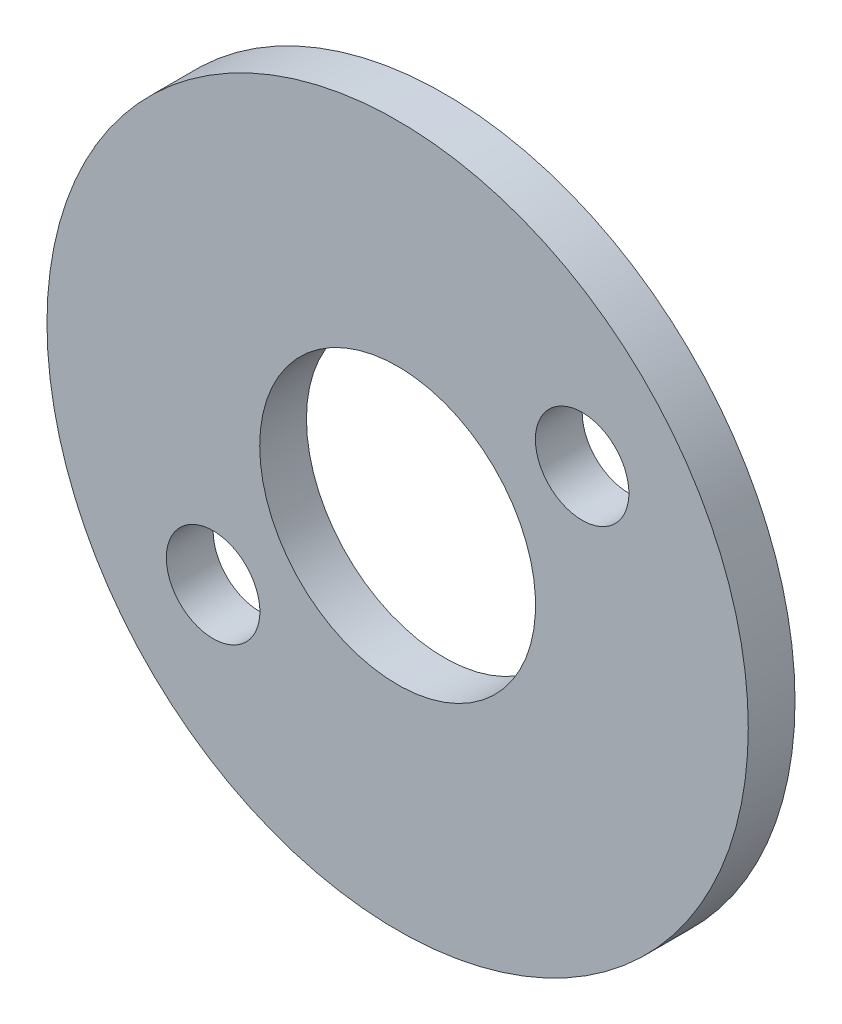
ISO-10303-21;
HEADER;
FILE_DESCRIPTION(('STEP AP214'),'2;1');
FILE_NAME('part.step','',(''),(''),'','','');
FILE_SCHEMA(('AUTOMOTIVE_DESIGN { 1 0 10303 214 1 1 1 1 }'));
ENDSEC;
DATA;
#1=APPLICATION_CONTEXT('core data for automotive mechanical design processes');
#2=APPLICATION_PROTOCOL_DEFINITION('international standard','automotive_design',2000,#1);
#3=PRODUCT_CONTEXT('',#1,'mechanical');
#4=PRODUCT('Part','Part','',(#3));
#5=PRODUCT_RELATED_PRODUCT_CATEGORY('part','',(#4));
#6=PRODUCT_DEFINITION_FORMATION('','',#4);
#7=PRODUCT_DEFINITION_CONTEXT('part definition',#1,'design');
#8=PRODUCT_DEFINITION('design','',#6,#7);
#9=PRODUCT_DEFINITION_SHAPE('','',#8);
#10=(LENGTH_UNIT() NAMED_UNIT(*) SI_UNIT(.MILLI.,.METRE.));
#11=(NAMED_UNIT(*) PLANE_ANGLE_UNIT() SI_UNIT($,.RADIAN.));
#12=(NAMED_UNIT(*) SI_UNIT($,.STERADIAN.) SOLID_ANGLE_UNIT());
#13=UNCERTAINTY_MEASURE_WITH_UNIT(LENGTH_MEASURE(1.E-05),#10,'distance_accuracy_value','');
#14=(GEOMETRIC_REPRESENTATION_CONTEXT(3) GLOBAL_UNCERTAINTY_ASSIGNED_CONTEXT((#13)) GLOBAL_UNIT_ASSIGNED_CONTEXT((#10,
#11,#12)) REPRESENTATION_CONTEXT('',''));
#15=CARTESIAN_POINT('',(0.,0.,0.));
#16=DIRECTION('',(0.,0.,1.));
#17=DIRECTION('',(1.,0.,0.));
#18=AXIS2_PLACEMENT_3D('',#15,#16,#17);
#19=CARTESIAN_POINT('',(0.,0.,1.));
#20=DIRECTION('',(0.,0.,-1.));
#21=DIRECTION('',(-1.,0.,0.));
#22=AXIS2_PLACEMENT_3D('',#19,#20,#21);
#23=CYLINDRICAL_SURFACE('',#22,7.5);
#24=CARTESIAN_POINT('',(0.,0.,1.));
#25=DIRECTION('',(0.,0.,1.));
#26=DIRECTION('',(1.,0.,0.));
#27=AXIS2_PLACEMENT_3D('',#24,#25,#26);
#28=CIRCLE('',#27,7.5);
#29=CARTESIAN_POINT('',(7.5,0.,1.));
#30=VERTEX_POINT('',#29);
#31=EDGE_CURVE('E10',#30,#30,#28,.T.);
#32=ORIENTED_EDGE('',*,*,#31,.F.);
#33=EDGE_LOOP('',(#32));
#34=FACE_BOUND('',#33,.T.);
#35=CARTESIAN_POINT('',(0.,0.,0.));
#36=DIRECTION('',(0.,0.,1.));
#37=DIRECTION('',(1.,0.,0.));
#38=AXIS2_PLACEMENT_3D('',#35,#36,#37);
#39=CIRCLE('',#38,7.5);
#40=CARTESIAN_POINT('',(7.5,0.,0.));
#41=VERTEX_POINT('',#40);
#42=EDGE_CURVE('E33',#41,#41,#39,.T.);
#43=ORIENTED_EDGE('',*,*,#42,.T.);
#44=EDGE_LOOP('',(#43));
#45=FACE_BOUND('',#44,.T.);
#46=ADVANCED_FACE('F30',(#34,#45),#23,.T.);
#47=CARTESIAN_POINT('',(0.,0.,1.));
#48=DIRECTION('',(0.,0.,1.));
#49=DIRECTION('',(1.,0.,0.));
#50=AXIS2_PLACEMENT_3D('',#47,#48,#49);
#51=PLANE('',#50);
#52=CARTESIAN_POINT('',(-3.94676108688162,-3.06970306757462,1.));
#53=DIRECTION('',(0.,0.,-1.));
#54=DIRECTION('',(-1.,0.,0.));
#55=AXIS2_PLACEMENT_3D('',#52,#53,#54);
#56=CIRCLE('',#55,1.);
#57=CARTESIAN_POINT('',(-4.94676108688162,-3.06970306757462,1.));
#58=VERTEX_POINT('',#57);
#59=EDGE_CURVE('E51',#58,#58,#56,.T.);
#60=ORIENTED_EDGE('',*,*,#59,.T.);
#61=EDGE_LOOP('',(#60));
#62=FACE_BOUND('',#61,.T.);
#63=CARTESIAN_POINT('',(3.94676108688162,3.06970306757462,1.));
#64=DIRECTION('',(0.,0.,-1.));
#65=DIRECTION('',(-1.,0.,0.));
#66=AXIS2_PLACEMENT_3D('',#63,#64,#65);
#67=CIRCLE('',#66,1.);
#68=CARTESIAN_POINT('',(2.94676108688162,3.06970306757462,1.));
#69=VERTEX_POINT('',#68);
#70=EDGE_CURVE('E45',#69,#69,#67,.T.);
#71=ORIENTED_EDGE('',*,*,#70,.T.);
#72=EDGE_LOOP('',(#71));
#73=FACE_BOUND('',#72,.T.);
#74=CARTESIAN_POINT('',(0.,0.,1.));
#75=DIRECTION('',(0.,0.,-1.));
#76=DIRECTION('',(-1.,0.,0.));
#77=AXIS2_PLACEMENT_3D('',#74,#75,#76);
#78=CIRCLE('',#77,2.95);
#79=CARTESIAN_POINT('',(-2.95,0.,1.));
#80=VERTEX_POINT('',#79);
#81=EDGE_CURVE('E40',#80,#80,#78,.T.);
#82=ORIENTED_EDGE('',*,*,#81,.T.);
#83=EDGE_LOOP('',(#82));
#84=FACE_BOUND('',#83,.T.);
#85=ORIENTED_EDGE('',*,*,#31,.T.);
#86=EDGE_LOOP('',(#85));
#87=FACE_BOUND('',#86,.T.);
#88=ADVANCED_FACE('F60',(#62,#73,#84,#87),#51,.T.);
#89=CARTESIAN_POINT('',(0.,0.,0.));
#90=DIRECTION('',(0.,0.,1.));
#91=DIRECTION('',(1.,0.,0.));
#92=AXIS2_PLACEMENT_3D('',#89,#90,#91);
#93=PLANE('',#92);
#94=CARTESIAN_POINT('',(-3.94676108688162,-3.06970306757462,0.));
#95=DIRECTION('',(0.,0.,-1.));
#96=DIRECTION('',(-1.,0.,0.));
#97=AXIS2_PLACEMENT_3D('',#94,#95,#96);
#98=CIRCLE('',#97,1.);
#99=CARTESIAN_POINT('',(-4.94676108688162,-3.06970306757462,0.));
#100=VERTEX_POINT('',#99);
#101=EDGE_CURVE('E54',#100,#100,#98,.T.);
#102=ORIENTED_EDGE('',*,*,#101,.F.);
#103=EDGE_LOOP('',(#102));
#104=FACE_BOUND('',#103,.T.);
#105=CARTESIAN_POINT('',(3.94676108688162,3.06970306757462,0.));
#106=DIRECTION('',(0.,0.,-1.));
#107=DIRECTION('',(-1.,0.,0.));
#108=AXIS2_PLACEMENT_3D('',#105,#106,#107);
#109=CIRCLE('',#108,1.);
#110=CARTESIAN_POINT('',(2.94676108688162,3.06970306757462,0.));
#111=VERTEX_POINT('',#110);
#112=EDGE_CURVE('E48',#111,#111,#109,.T.);
#113=ORIENTED_EDGE('',*,*,#112,.F.);
#114=EDGE_LOOP('',(#113));
#115=FACE_BOUND('',#114,.T.);
#116=CARTESIAN_POINT('',(0.,0.,0.));
#117=DIRECTION('',(0.,0.,-1.));
#118=DIRECTION('',(-1.,0.,0.));
#119=AXIS2_PLACEMENT_3D('',#116,#117,#118);
#120=CIRCLE('',#119,2.95);
#121=CARTESIAN_POINT('',(-2.95,0.,0.));
#122=VERTEX_POINT('',#121);
#123=EDGE_CURVE('E42',#122,#122,#120,.T.);
#124=ORIENTED_EDGE('',*,*,#123,.F.);
#125=EDGE_LOOP('',(#124));
#126=FACE_BOUND('',#125,.T.);
#127=ORIENTED_EDGE('',*,*,#42,.F.);
#128=EDGE_LOOP('',(#127));
#129=FACE_BOUND('',#128,.T.);
#130=ADVANCED_FACE('F70',(#104,#115,#126,#129),#93,.F.);
#131=CARTESIAN_POINT('',(0.,0.,1.));
#132=DIRECTION('',(0.,0.,-1.));
#133=DIRECTION('',(-1.,0.,0.));
#134=AXIS2_PLACEMENT_3D('',#131,#132,#133);
#135=CYLINDRICAL_SURFACE('',#134,2.95);
#136=ORIENTED_EDGE('',*,*,#81,.F.);
#137=EDGE_LOOP('',(#136));
#138=FACE_BOUND('',#137,.T.);
#139=ORIENTED_EDGE('',*,*,#123,.T.);
#140=EDGE_LOOP('',(#139));
#141=FACE_BOUND('',#140,.T.);
#142=ADVANCED_FACE('F73',(#138,#141),#135,.F.);
#143=CARTESIAN_POINT('',(3.94676108688162,3.06970306757462,1.));
#144=DIRECTION('',(0.,0.,-1.));
#145=DIRECTION('',(-1.,0.,0.));
#146=AXIS2_PLACEMENT_3D('',#143,#144,#145);
#147=CYLINDRICAL_SURFACE('',#146,1.);
#148=ORIENTED_EDGE('',*,*,#70,.F.);
#149=EDGE_LOOP('',(#148));
#150=FACE_BOUND('',#149,.T.);
#151=ORIENTED_EDGE('',*,*,#112,.T.);
#152=EDGE_LOOP('',(#151));
#153=FACE_BOUND('',#152,.T.);
#154=ADVANCED_FACE('F66',(#150,#153),#147,.F.);
#155=CARTESIAN_POINT('',(-3.94676108688162,-3.06970306757462,1.));
#156=DIRECTION('',(0.,0.,-1.));
#157=DIRECTION('',(-1.,0.,0.));
#158=AXIS2_PLACEMENT_3D('',#155,#156,#157);
#159=CYLINDRICAL_SURFACE('',#158,1.);
#160=ORIENTED_EDGE('',*,*,#59,.F.);
#161=EDGE_LOOP('',(#160));
#162=FACE_BOUND('',#161,.T.);
#163=ORIENTED_EDGE('',*,*,#101,.T.);
#164=EDGE_LOOP('',(#163));
#165=FACE_BOUND('',#164,.T.);
#166=ADVANCED_FACE('F63',(#162,#165),#159,.F.);
#167=CLOSED_SHELL('',(#46,#88,#130,#142,#154,#166));
#168=MANIFOLD_SOLID_BREP('B2',#167);
#169=ADVANCED_BREP_SHAPE_REPRESENTATION('',(#18,#168),#14);
#170=SHAPE_DEFINITION_REPRESENTATION(#9,#169);
ENDSEC;
END-ISO-10303-21;
